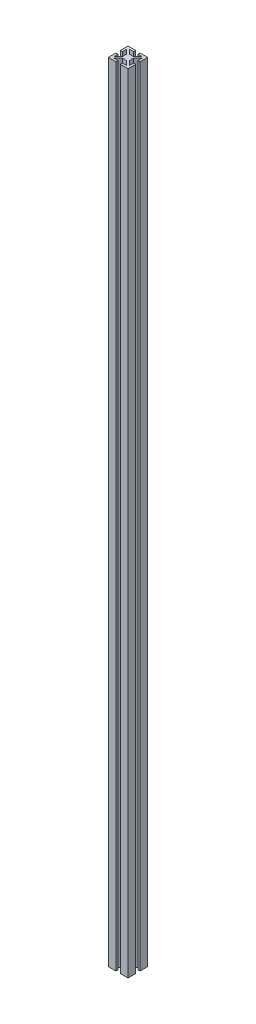
ISO-10303-21;
HEADER;
FILE_DESCRIPTION(('STEP AP214'),'2;1');
FILE_NAME('part.step','',(''),(''),'','','');
FILE_SCHEMA(('AUTOMOTIVE_DESIGN { 1 0 10303 214 1 1 1 1 }'));
ENDSEC;
DATA;
#1=APPLICATION_CONTEXT('core data for automotive mechanical design processes');
#2=APPLICATION_PROTOCOL_DEFINITION('international standard','automotive_design',2000,#1);
#3=PRODUCT_CONTEXT('',#1,'mechanical');
#4=PRODUCT('Part','Part','',(#3));
#5=PRODUCT_RELATED_PRODUCT_CATEGORY('part','',(#4));
#6=PRODUCT_DEFINITION_FORMATION('','',#4);
#7=PRODUCT_DEFINITION_CONTEXT('part definition',#1,'design');
#8=PRODUCT_DEFINITION('design','',#6,#7);
#9=PRODUCT_DEFINITION_SHAPE('','',#8);
#10=(LENGTH_UNIT() NAMED_UNIT(*) SI_UNIT(.MILLI.,.METRE.));
#11=(NAMED_UNIT(*) PLANE_ANGLE_UNIT() SI_UNIT($,.RADIAN.));
#12=(NAMED_UNIT(*) SI_UNIT($,.STERADIAN.) SOLID_ANGLE_UNIT());
#13=UNCERTAINTY_MEASURE_WITH_UNIT(LENGTH_MEASURE(1.E-05),#10,'distance_accuracy_value','');
#14=(GEOMETRIC_REPRESENTATION_CONTEXT(3) GLOBAL_UNCERTAINTY_ASSIGNED_CONTEXT((#13)) GLOBAL_UNIT_ASSIGNED_CONTEXT((#10,
#11,#12)) REPRESENTATION_CONTEXT('',''));
#15=CARTESIAN_POINT('',(0.,0.,0.));
#16=DIRECTION('',(0.,0.,1.));
#17=DIRECTION('',(1.,0.,0.));
#18=AXIS2_PLACEMENT_3D('',#15,#16,#17);
#19=CARTESIAN_POINT('',(-19.05,1524.,-19.05));
#20=DIRECTION('',(1.,0.,0.));
#21=DIRECTION('',(0.,0.,-1.));
#22=AXIS2_PLACEMENT_3D('',#19,#20,#21);
#23=PLANE('',#22);
#24=DIRECTION('',(0.,0.,1.));
#25=VECTOR('',#24,1.);
#26=CARTESIAN_POINT('',(-19.05,0.,-19.05));
#27=LINE('',#26,#25);
#28=CARTESIAN_POINT('',(-19.05,0.,-19.05));
#29=VERTEX_POINT('',#28);
#30=CARTESIAN_POINT('',(-19.05,0.,-4.06399999999999));
#31=VERTEX_POINT('',#30);
#32=EDGE_CURVE('E297',#29,#31,#27,.T.);
#33=ORIENTED_EDGE('',*,*,#32,.T.);
#34=DIRECTION('',(0.,-1.,0.));
#35=VECTOR('',#34,1.);
#36=CARTESIAN_POINT('',(-19.05,1524.,-4.06399999999999));
#37=LINE('',#36,#35);
#38=CARTESIAN_POINT('',(-19.05,1524.,-4.06399999999999));
#39=VERTEX_POINT('',#38);
#40=EDGE_CURVE('E11',#39,#31,#37,.T.);
#41=ORIENTED_EDGE('',*,*,#40,.F.);
#42=DIRECTION('',(0.,0.,1.));
#43=VECTOR('',#42,1.);
#44=CARTESIAN_POINT('',(-19.05,1524.,-19.05));
#45=LINE('',#44,#43);
#46=CARTESIAN_POINT('',(-19.05,1524.,-19.05));
#47=VERTEX_POINT('',#46);
#48=EDGE_CURVE('E367',#47,#39,#45,.T.);
#49=ORIENTED_EDGE('',*,*,#48,.F.);
#50=DIRECTION('',(0.,-1.,0.));
#51=VECTOR('',#50,1.);
#52=CARTESIAN_POINT('',(-19.05,1524.,-19.05));
#53=LINE('',#52,#51);
#54=EDGE_CURVE('E293',#47,#29,#53,.T.);
#55=ORIENTED_EDGE('',*,*,#54,.T.);
#56=EDGE_LOOP('',(#33,#41,#49,#55));
#57=FACE_BOUND('',#56,.T.);
#58=ADVANCED_FACE('F33',(#57),#23,.F.);
#59=CARTESIAN_POINT('',(-19.05,1524.,-4.06399999999999));
#60=DIRECTION('',(0.,0.,-1.));
#61=DIRECTION('',(-1.,0.,0.));
#62=AXIS2_PLACEMENT_3D('',#59,#60,#61);
#63=PLANE('',#62);
#64=DIRECTION('',(1.,0.,0.));
#65=VECTOR('',#64,1.);
#66=CARTESIAN_POINT('',(-19.05,0.,-4.06399999999999));
#67=LINE('',#66,#65);
#68=CARTESIAN_POINT('',(-14.986,0.,-4.06399999999999));
#69=VERTEX_POINT('',#68);
#70=EDGE_CURVE('E300',#31,#69,#67,.T.);
#71=ORIENTED_EDGE('',*,*,#70,.T.);
#72=DIRECTION('',(0.,-1.,0.));
#73=VECTOR('',#72,1.);
#74=CARTESIAN_POINT('',(-14.986,1524.,-4.06399999999999));
#75=LINE('',#74,#73);
#76=CARTESIAN_POINT('',(-14.986,1524.,-4.06399999999999));
#77=VERTEX_POINT('',#76);
#78=EDGE_CURVE('E41',#77,#69,#75,.T.);
#79=ORIENTED_EDGE('',*,*,#78,.F.);
#80=DIRECTION('',(1.,0.,0.));
#81=VECTOR('',#80,1.);
#82=CARTESIAN_POINT('',(-19.05,1524.,-4.06399999999999));
#83=LINE('',#82,#81);
#84=EDGE_CURVE('E176',#39,#77,#83,.T.);
#85=ORIENTED_EDGE('',*,*,#84,.F.);
#86=ORIENTED_EDGE('',*,*,#40,.T.);
#87=EDGE_LOOP('',(#71,#79,#85,#86));
#88=FACE_BOUND('',#87,.T.);
#89=ADVANCED_FACE('F565',(#88),#63,.F.);
#90=CARTESIAN_POINT('',(-14.986,1524.,-4.06399999999999));
#91=DIRECTION('',(-1.,0.,0.));
#92=DIRECTION('',(0.,0.,1.));
#93=AXIS2_PLACEMENT_3D('',#90,#91,#92);
#94=PLANE('',#93);
#95=DIRECTION('',(0.,0.,-1.));
#96=VECTOR('',#95,1.);
#97=CARTESIAN_POINT('',(-14.986,0.,-4.06399999999999));
#98=LINE('',#97,#96);
#99=CARTESIAN_POINT('',(-14.986,0.,-12.1123180412578));
#100=VERTEX_POINT('',#99);
#101=EDGE_CURVE('E302',#69,#100,#98,.T.);
#102=ORIENTED_EDGE('',*,*,#101,.T.);
#103=DIRECTION('',(0.,-1.,0.));
#104=VECTOR('',#103,1.);
#105=CARTESIAN_POINT('',(-14.986,1524.,-12.1123180412578));
#106=LINE('',#105,#104);
#107=CARTESIAN_POINT('',(-14.986,1524.,-12.1123180412578));
#108=VERTEX_POINT('',#107);
#109=EDGE_CURVE('E458',#108,#100,#106,.T.);
#110=ORIENTED_EDGE('',*,*,#109,.F.);
#111=DIRECTION('',(0.,0.,-1.));
#112=VECTOR('',#111,1.);
#113=CARTESIAN_POINT('',(-14.986,1524.,-4.06399999999999));
#114=LINE('',#113,#112);
#115=EDGE_CURVE('E466',#77,#108,#114,.T.);
#116=ORIENTED_EDGE('',*,*,#115,.F.);
#117=ORIENTED_EDGE('',*,*,#78,.T.);
#118=EDGE_LOOP('',(#102,#110,#116,#117));
#119=FACE_BOUND('',#118,.T.);
#120=ADVANCED_FACE('F464',(#119),#94,.F.);
#121=CARTESIAN_POINT('',(-14.986,1524.,-12.1123180412578));
#122=DIRECTION('',(0.707106781186547,0.,-0.707106781186548));
#123=DIRECTION('',(-0.707106781186548,0.,-0.707106781186547));
#124=AXIS2_PLACEMENT_3D('',#121,#122,#123);
#125=PLANE('',#124);
#126=DIRECTION('',(0.707106781186548,0.,0.707106781186547));
#127=VECTOR('',#126,1.);
#128=CARTESIAN_POINT('',(-14.986,0.,-12.1123180412578));
#129=LINE('',#128,#127);
#130=CARTESIAN_POINT('',(-6.7564,0.,-3.88271804125786));
#131=VERTEX_POINT('',#130);
#132=EDGE_CURVE('E304',#100,#131,#129,.T.);
#133=ORIENTED_EDGE('',*,*,#132,.T.);
#134=DIRECTION('',(0.,-1.,0.));
#135=VECTOR('',#134,1.);
#136=CARTESIAN_POINT('',(-6.7564,1524.,-3.88271804125786));
#137=LINE('',#136,#135);
#138=CARTESIAN_POINT('',(-6.7564,1524.,-3.88271804125786));
#139=VERTEX_POINT('',#138);
#140=EDGE_CURVE('E455',#139,#131,#137,.T.);
#141=ORIENTED_EDGE('',*,*,#140,.F.);
#142=DIRECTION('',(0.707106781186548,0.,0.707106781186547));
#143=VECTOR('',#142,1.);
#144=CARTESIAN_POINT('',(-14.986,1524.,-12.1123180412578));
#145=LINE('',#144,#143);
#146=EDGE_CURVE('E484',#108,#139,#145,.T.);
#147=ORIENTED_EDGE('',*,*,#146,.F.);
#148=ORIENTED_EDGE('',*,*,#109,.T.);
#149=EDGE_LOOP('',(#133,#141,#147,#148));
#150=FACE_BOUND('',#149,.T.);
#151=ADVANCED_FACE('F475',(#150),#125,.F.);
#152=CARTESIAN_POINT('',(-6.7564,1524.,-3.88271804125786));
#153=DIRECTION('',(1.,0.,0.));
#154=DIRECTION('',(0.,0.,-1.));
#155=AXIS2_PLACEMENT_3D('',#152,#153,#154);
#156=PLANE('',#155);
#157=DIRECTION('',(0.,0.,1.));
#158=VECTOR('',#157,1.);
#159=CARTESIAN_POINT('',(-6.7564,0.,-3.88271804125786));
#160=LINE('',#159,#158);
#161=CARTESIAN_POINT('',(-6.7564,0.,3.88271804125787));
#162=VERTEX_POINT('',#161);
#163=EDGE_CURVE('E306',#131,#162,#160,.T.);
#164=ORIENTED_EDGE('',*,*,#163,.T.);
#165=DIRECTION('',(0.,-1.,0.));
#166=VECTOR('',#165,1.);
#167=CARTESIAN_POINT('',(-6.7564,1524.,3.88271804125787));
#168=LINE('',#167,#166);
#169=CARTESIAN_POINT('',(-6.7564,1524.,3.88271804125787));
#170=VERTEX_POINT('',#169);
#171=EDGE_CURVE('E452',#170,#162,#168,.T.);
#172=ORIENTED_EDGE('',*,*,#171,.F.);
#173=DIRECTION('',(0.,0.,1.));
#174=VECTOR('',#173,1.);
#175=CARTESIAN_POINT('',(-6.7564,1524.,-3.88271804125786));
#176=LINE('',#175,#174);
#177=EDGE_CURVE('E481',#139,#170,#176,.T.);
#178=ORIENTED_EDGE('',*,*,#177,.F.);
#179=ORIENTED_EDGE('',*,*,#140,.T.);
#180=EDGE_LOOP('',(#164,#172,#178,#179));
#181=FACE_BOUND('',#180,.T.);
#182=ADVANCED_FACE('F479',(#181),#156,.F.);
#183=CARTESIAN_POINT('',(-14.986,1524.,12.1123180412579));
#184=DIRECTION('',(0.707106781186548,0.,0.707106781186547));
#185=DIRECTION('',(0.707106781186547,0.,-0.707106781186548));
#186=AXIS2_PLACEMENT_3D('',#183,#184,#185);
#187=PLANE('',#186);
#188=DIRECTION('',(-0.707106781186547,0.,0.707106781186548));
#189=VECTOR('',#188,1.);
#190=CARTESIAN_POINT('',(-14.986,0.,12.1123180412579));
#191=LINE('',#190,#189);
#192=CARTESIAN_POINT('',(-14.986,0.,12.1123180412579));
#193=VERTEX_POINT('',#192);
#194=EDGE_CURVE('E308',#162,#193,#191,.T.);
#195=ORIENTED_EDGE('',*,*,#194,.T.);
#196=DIRECTION('',(0.,-1.,0.));
#197=VECTOR('',#196,1.);
#198=CARTESIAN_POINT('',(-14.986,1524.,12.1123180412579));
#199=LINE('',#198,#197);
#200=CARTESIAN_POINT('',(-14.986,1524.,12.1123180412579));
#201=VERTEX_POINT('',#200);
#202=EDGE_CURVE('E449',#201,#193,#199,.T.);
#203=ORIENTED_EDGE('',*,*,#202,.F.);
#204=DIRECTION('',(-0.707106781186547,0.,0.707106781186548));
#205=VECTOR('',#204,1.);
#206=CARTESIAN_POINT('',(-14.986,1524.,12.1123180412579));
#207=LINE('',#206,#205);
#208=EDGE_CURVE('E483',#170,#201,#207,.T.);
#209=ORIENTED_EDGE('',*,*,#208,.F.);
#210=ORIENTED_EDGE('',*,*,#171,.T.);
#211=EDGE_LOOP('',(#195,#203,#209,#210));
#212=FACE_BOUND('',#211,.T.);
#213=ADVANCED_FACE('F578',(#212),#187,.F.);
#214=CARTESIAN_POINT('',(-14.986,1524.,4.06399999999999));
#215=DIRECTION('',(-1.,0.,0.));
#216=DIRECTION('',(0.,0.,1.));
#217=AXIS2_PLACEMENT_3D('',#214,#215,#216);
#218=PLANE('',#217);
#219=DIRECTION('',(0.,0.,-1.));
#220=VECTOR('',#219,1.);
#221=CARTESIAN_POINT('',(-14.986,0.,4.06399999999999));
#222=LINE('',#221,#220);
#223=CARTESIAN_POINT('',(-14.986,0.,4.06399999999999));
#224=VERTEX_POINT('',#223);
#225=EDGE_CURVE('E310',#193,#224,#222,.T.);
#226=ORIENTED_EDGE('',*,*,#225,.T.);
#227=DIRECTION('',(0.,-1.,0.));
#228=VECTOR('',#227,1.);
#229=CARTESIAN_POINT('',(-14.986,1524.,4.06399999999999));
#230=LINE('',#229,#228);
#231=CARTESIAN_POINT('',(-14.986,1524.,4.06399999999999));
#232=VERTEX_POINT('',#231);
#233=EDGE_CURVE('E446',#232,#224,#230,.T.);
#234=ORIENTED_EDGE('',*,*,#233,.F.);
#235=DIRECTION('',(0.,0.,-1.));
#236=VECTOR('',#235,1.);
#237=CARTESIAN_POINT('',(-14.986,1524.,4.06399999999999));
#238=LINE('',#237,#236);
#239=EDGE_CURVE('E486',#201,#232,#238,.T.);
#240=ORIENTED_EDGE('',*,*,#239,.F.);
#241=ORIENTED_EDGE('',*,*,#202,.T.);
#242=EDGE_LOOP('',(#226,#234,#240,#241));
#243=FACE_BOUND('',#242,.T.);
#244=ADVANCED_FACE('F581',(#243),#218,.F.);
#245=CARTESIAN_POINT('',(-19.05,1524.,4.06399999999999));
#246=DIRECTION('',(0.,0.,1.));
#247=DIRECTION('',(1.,0.,0.));
#248=AXIS2_PLACEMENT_3D('',#245,#246,#247);
#249=PLANE('',#248);
#250=DIRECTION('',(-1.,0.,0.));
#251=VECTOR('',#250,1.);
#252=CARTESIAN_POINT('',(-19.05,0.,4.06399999999999));
#253=LINE('',#252,#251);
#254=CARTESIAN_POINT('',(-19.05,0.,4.06399999999999));
#255=VERTEX_POINT('',#254);
#256=EDGE_CURVE('E312',#224,#255,#253,.T.);
#257=ORIENTED_EDGE('',*,*,#256,.T.);
#258=DIRECTION('',(0.,-1.,0.));
#259=VECTOR('',#258,1.);
#260=CARTESIAN_POINT('',(-19.05,1524.,4.06399999999999));
#261=LINE('',#260,#259);
#262=CARTESIAN_POINT('',(-19.05,1524.,4.06399999999999));
#263=VERTEX_POINT('',#262);
#264=EDGE_CURVE('E443',#263,#255,#261,.T.);
#265=ORIENTED_EDGE('',*,*,#264,.F.);
#266=DIRECTION('',(-1.,0.,0.));
#267=VECTOR('',#266,1.);
#268=CARTESIAN_POINT('',(-19.05,1524.,4.06399999999999));
#269=LINE('',#268,#267);
#270=EDGE_CURVE('E492',#232,#263,#269,.T.);
#271=ORIENTED_EDGE('',*,*,#270,.F.);
#272=ORIENTED_EDGE('',*,*,#233,.T.);
#273=EDGE_LOOP('',(#257,#265,#271,#272));
#274=FACE_BOUND('',#273,.T.);
#275=ADVANCED_FACE('F585',(#274),#249,.F.);
#276=CARTESIAN_POINT('',(-19.05,1524.,19.05));
#277=DIRECTION('',(1.,0.,0.));
#278=DIRECTION('',(0.,0.,-1.));
#279=AXIS2_PLACEMENT_3D('',#276,#277,#278);
#280=PLANE('',#279);
#281=DIRECTION('',(0.,0.,1.));
#282=VECTOR('',#281,1.);
#283=CARTESIAN_POINT('',(-19.05,0.,19.05));
#284=LINE('',#283,#282);
#285=CARTESIAN_POINT('',(-19.05,0.,19.05));
#286=VERTEX_POINT('',#285);
#287=EDGE_CURVE('E314',#255,#286,#284,.T.);
#288=ORIENTED_EDGE('',*,*,#287,.T.);
#289=DIRECTION('',(0.,-1.,0.));
#290=VECTOR('',#289,1.);
#291=CARTESIAN_POINT('',(-19.05,1524.,19.05));
#292=LINE('',#291,#290);
#293=CARTESIAN_POINT('',(-19.05,1524.,19.05));
#294=VERTEX_POINT('',#293);
#295=EDGE_CURVE('E440',#294,#286,#292,.T.);
#296=ORIENTED_EDGE('',*,*,#295,.F.);
#297=DIRECTION('',(0.,0.,1.));
#298=VECTOR('',#297,1.);
#299=CARTESIAN_POINT('',(-19.05,1524.,19.05));
#300=LINE('',#299,#298);
#301=EDGE_CURVE('E494',#263,#294,#300,.T.);
#302=ORIENTED_EDGE('',*,*,#301,.F.);
#303=ORIENTED_EDGE('',*,*,#264,.T.);
#304=EDGE_LOOP('',(#288,#296,#302,#303));
#305=FACE_BOUND('',#304,.T.);
#306=ADVANCED_FACE('F589',(#305),#280,.F.);
#307=CARTESIAN_POINT('',(-19.05,1524.,19.05));
#308=DIRECTION('',(0.,0.,-1.));
#309=DIRECTION('',(-1.,0.,0.));
#310=AXIS2_PLACEMENT_3D('',#307,#308,#309);
#311=PLANE('',#310);
#312=DIRECTION('',(1.,0.,0.));
#313=VECTOR('',#312,1.);
#314=CARTESIAN_POINT('',(-19.05,0.,19.05));
#315=LINE('',#314,#313);
#316=CARTESIAN_POINT('',(-4.064,0.,19.05));
#317=VERTEX_POINT('',#316);
#318=EDGE_CURVE('E316',#286,#317,#315,.T.);
#319=ORIENTED_EDGE('',*,*,#318,.T.);
#320=DIRECTION('',(0.,-1.,0.));
#321=VECTOR('',#320,1.);
#322=CARTESIAN_POINT('',(-4.064,1524.,19.05));
#323=LINE('',#322,#321);
#324=CARTESIAN_POINT('',(-4.064,1524.,19.05));
#325=VERTEX_POINT('',#324);
#326=EDGE_CURVE('E437',#325,#317,#323,.T.);
#327=ORIENTED_EDGE('',*,*,#326,.F.);
#328=DIRECTION('',(1.,0.,0.));
#329=VECTOR('',#328,1.);
#330=CARTESIAN_POINT('',(-19.05,1524.,19.05));
#331=LINE('',#330,#329);
#332=EDGE_CURVE('E496',#294,#325,#331,.T.);
#333=ORIENTED_EDGE('',*,*,#332,.F.);
#334=ORIENTED_EDGE('',*,*,#295,.T.);
#335=EDGE_LOOP('',(#319,#327,#333,#334));
#336=FACE_BOUND('',#335,.T.);
#337=ADVANCED_FACE('F593',(#336),#311,.F.);
#338=CARTESIAN_POINT('',(-4.064,1524.,19.05));
#339=DIRECTION('',(-1.,0.,0.));
#340=DIRECTION('',(0.,0.,1.));
#341=AXIS2_PLACEMENT_3D('',#338,#339,#340);
#342=PLANE('',#341);
#343=DIRECTION('',(0.,0.,-1.));
#344=VECTOR('',#343,1.);
#345=CARTESIAN_POINT('',(-4.064,0.,19.05));
#346=LINE('',#345,#344);
#347=CARTESIAN_POINT('',(-4.064,0.,14.986));
#348=VERTEX_POINT('',#347);
#349=EDGE_CURVE('E318',#317,#348,#346,.T.);
#350=ORIENTED_EDGE('',*,*,#349,.T.);
#351=DIRECTION('',(0.,-1.,0.));
#352=VECTOR('',#351,1.);
#353=CARTESIAN_POINT('',(-4.064,1524.,14.986));
#354=LINE('',#353,#352);
#355=CARTESIAN_POINT('',(-4.064,1524.,14.986));
#356=VERTEX_POINT('',#355);
#357=EDGE_CURVE('E434',#356,#348,#354,.T.);
#358=ORIENTED_EDGE('',*,*,#357,.F.);
#359=DIRECTION('',(0.,0.,-1.));
#360=VECTOR('',#359,1.);
#361=CARTESIAN_POINT('',(-4.064,1524.,19.05));
#362=LINE('',#361,#360);
#363=EDGE_CURVE('E498',#325,#356,#362,.T.);
#364=ORIENTED_EDGE('',*,*,#363,.F.);
#365=ORIENTED_EDGE('',*,*,#326,.T.);
#366=EDGE_LOOP('',(#350,#358,#364,#365));
#367=FACE_BOUND('',#366,.T.);
#368=ADVANCED_FACE('F597',(#367),#342,.F.);
#369=CARTESIAN_POINT('',(-4.064,1524.,14.986));
#370=DIRECTION('',(0.,0.,1.));
#371=DIRECTION('',(1.,0.,0.));
#372=AXIS2_PLACEMENT_3D('',#369,#370,#371);
#373=PLANE('',#372);
#374=DIRECTION('',(-1.,0.,0.));
#375=VECTOR('',#374,1.);
#376=CARTESIAN_POINT('',(-4.064,0.,14.986));
#377=LINE('',#376,#375);
#378=CARTESIAN_POINT('',(-12.1123180412579,0.,14.986));
#379=VERTEX_POINT('',#378);
#380=EDGE_CURVE('E320',#348,#379,#377,.T.);
#381=ORIENTED_EDGE('',*,*,#380,.T.);
#382=DIRECTION('',(0.,-1.,0.));
#383=VECTOR('',#382,1.);
#384=CARTESIAN_POINT('',(-12.1123180412579,1524.,14.986));
#385=LINE('',#384,#383);
#386=CARTESIAN_POINT('',(-12.1123180412579,1524.,14.986));
#387=VERTEX_POINT('',#386);
#388=EDGE_CURVE('E431',#387,#379,#385,.T.);
#389=ORIENTED_EDGE('',*,*,#388,.F.);
#390=DIRECTION('',(-1.,0.,0.));
#391=VECTOR('',#390,1.);
#392=CARTESIAN_POINT('',(-4.064,1524.,14.986));
#393=LINE('',#392,#391);
#394=EDGE_CURVE('E500',#356,#387,#393,.T.);
#395=ORIENTED_EDGE('',*,*,#394,.F.);
#396=ORIENTED_EDGE('',*,*,#357,.T.);
#397=EDGE_LOOP('',(#381,#389,#395,#396));
#398=FACE_BOUND('',#397,.T.);
#399=ADVANCED_FACE('F601',(#398),#373,.F.);
#400=CARTESIAN_POINT('',(-12.1123180412579,1524.,14.986));
#401=DIRECTION('',(-0.707106781186548,0.,-0.707106781186547));
#402=DIRECTION('',(-0.707106781186547,0.,0.707106781186548));
#403=AXIS2_PLACEMENT_3D('',#400,#401,#402);
#404=PLANE('',#403);
#405=DIRECTION('',(0.707106781186547,0.,-0.707106781186548));
#406=VECTOR('',#405,1.);
#407=CARTESIAN_POINT('',(-12.1123180412579,0.,14.986));
#408=LINE('',#407,#406);
#409=CARTESIAN_POINT('',(-3.88271804125786,0.,6.7564));
#410=VERTEX_POINT('',#409);
#411=EDGE_CURVE('E322',#379,#410,#408,.T.);
#412=ORIENTED_EDGE('',*,*,#411,.T.);
#413=DIRECTION('',(0.,-1.,0.));
#414=VECTOR('',#413,1.);
#415=CARTESIAN_POINT('',(-3.88271804125786,1524.,6.7564));
#416=LINE('',#415,#414);
#417=CARTESIAN_POINT('',(-3.88271804125786,1524.,6.7564));
#418=VERTEX_POINT('',#417);
#419=EDGE_CURVE('E428',#418,#410,#416,.T.);
#420=ORIENTED_EDGE('',*,*,#419,.F.);
#421=DIRECTION('',(0.707106781186547,0.,-0.707106781186548));
#422=VECTOR('',#421,1.);
#423=CARTESIAN_POINT('',(-12.1123180412579,1524.,14.986));
#424=LINE('',#423,#422);
#425=EDGE_CURVE('E502',#387,#418,#424,.T.);
#426=ORIENTED_EDGE('',*,*,#425,.F.);
#427=ORIENTED_EDGE('',*,*,#388,.T.);
#428=EDGE_LOOP('',(#412,#420,#426,#427));
#429=FACE_BOUND('',#428,.T.);
#430=ADVANCED_FACE('F605',(#429),#404,.F.);
#431=CARTESIAN_POINT('',(-3.88271804125786,1524.,6.7564));
#432=DIRECTION('',(0.,0.,-1.));
#433=DIRECTION('',(-1.,0.,0.));
#434=AXIS2_PLACEMENT_3D('',#431,#432,#433);
#435=PLANE('',#434);
#436=DIRECTION('',(1.,0.,0.));
#437=VECTOR('',#436,1.);
#438=CARTESIAN_POINT('',(-3.88271804125786,0.,6.7564));
#439=LINE('',#438,#437);
#440=CARTESIAN_POINT('',(3.88271804125786,0.,6.7564));
#441=VERTEX_POINT('',#440);
#442=EDGE_CURVE('E324',#410,#441,#439,.T.);
#443=ORIENTED_EDGE('',*,*,#442,.T.);
#444=DIRECTION('',(0.,-1.,0.));
#445=VECTOR('',#444,1.);
#446=CARTESIAN_POINT('',(3.88271804125786,1524.,6.7564));
#447=LINE('',#446,#445);
#448=CARTESIAN_POINT('',(3.88271804125786,1524.,6.7564));
#449=VERTEX_POINT('',#448);
#450=EDGE_CURVE('E425',#449,#441,#447,.T.);
#451=ORIENTED_EDGE('',*,*,#450,.F.);
#452=DIRECTION('',(1.,0.,0.));
#453=VECTOR('',#452,1.);
#454=CARTESIAN_POINT('',(-3.88271804125786,1524.,6.7564));
#455=LINE('',#454,#453);
#456=EDGE_CURVE('E504',#418,#449,#455,.T.);
#457=ORIENTED_EDGE('',*,*,#456,.F.);
#458=ORIENTED_EDGE('',*,*,#419,.T.);
#459=EDGE_LOOP('',(#443,#451,#457,#458));
#460=FACE_BOUND('',#459,.T.);
#461=ADVANCED_FACE('F609',(#460),#435,.F.);
#462=CARTESIAN_POINT('',(12.1123180412579,1524.,14.986));
#463=DIRECTION('',(0.707106781186548,0.,-0.707106781186548));
#464=DIRECTION('',(-0.707106781186548,0.,-0.707106781186548));
#465=AXIS2_PLACEMENT_3D('',#462,#463,#464);
#466=PLANE('',#465);
#467=DIRECTION('',(0.707106781186547,0.,0.707106781186547));
#468=VECTOR('',#467,1.);
#469=CARTESIAN_POINT('',(12.1123180412579,0.,14.986));
#470=LINE('',#469,#468);
#471=CARTESIAN_POINT('',(12.1123180412579,0.,14.986));
#472=VERTEX_POINT('',#471);
#473=EDGE_CURVE('E326',#441,#472,#470,.T.);
#474=ORIENTED_EDGE('',*,*,#473,.T.);
#475=DIRECTION('',(0.,-1.,0.));
#476=VECTOR('',#475,1.);
#477=CARTESIAN_POINT('',(12.1123180412579,1524.,14.986));
#478=LINE('',#477,#476);
#479=CARTESIAN_POINT('',(12.1123180412579,1524.,14.986));
#480=VERTEX_POINT('',#479);
#481=EDGE_CURVE('E422',#480,#472,#478,.T.);
#482=ORIENTED_EDGE('',*,*,#481,.F.);
#483=DIRECTION('',(0.707106781186547,0.,0.707106781186547));
#484=VECTOR('',#483,1.);
#485=CARTESIAN_POINT('',(12.1123180412579,1524.,14.986));
#486=LINE('',#485,#484);
#487=EDGE_CURVE('E506',#449,#480,#486,.T.);
#488=ORIENTED_EDGE('',*,*,#487,.F.);
#489=ORIENTED_EDGE('',*,*,#450,.T.);
#490=EDGE_LOOP('',(#474,#482,#488,#489));
#491=FACE_BOUND('',#490,.T.);
#492=ADVANCED_FACE('F613',(#491),#466,.F.);
#493=CARTESIAN_POINT('',(4.064,1524.,14.986));
#494=DIRECTION('',(0.,0.,1.));
#495=DIRECTION('',(1.,0.,0.));
#496=AXIS2_PLACEMENT_3D('',#493,#494,#495);
#497=PLANE('',#496);
#498=DIRECTION('',(-1.,0.,0.));
#499=VECTOR('',#498,1.);
#500=CARTESIAN_POINT('',(4.064,0.,14.986));
#501=LINE('',#500,#499);
#502=CARTESIAN_POINT('',(4.064,0.,14.986));
#503=VERTEX_POINT('',#502);
#504=EDGE_CURVE('E328',#472,#503,#501,.T.);
#505=ORIENTED_EDGE('',*,*,#504,.T.);
#506=DIRECTION('',(0.,-1.,0.));
#507=VECTOR('',#506,1.);
#508=CARTESIAN_POINT('',(4.064,1524.,14.986));
#509=LINE('',#508,#507);
#510=CARTESIAN_POINT('',(4.064,1524.,14.986));
#511=VERTEX_POINT('',#510);
#512=EDGE_CURVE('E419',#511,#503,#509,.T.);
#513=ORIENTED_EDGE('',*,*,#512,.F.);
#514=DIRECTION('',(-1.,0.,0.));
#515=VECTOR('',#514,1.);
#516=CARTESIAN_POINT('',(4.064,1524.,14.986));
#517=LINE('',#516,#515);
#518=EDGE_CURVE('E508',#480,#511,#517,.T.);
#519=ORIENTED_EDGE('',*,*,#518,.F.);
#520=ORIENTED_EDGE('',*,*,#481,.T.);
#521=EDGE_LOOP('',(#505,#513,#519,#520));
#522=FACE_BOUND('',#521,.T.);
#523=ADVANCED_FACE('F617',(#522),#497,.F.);
#524=CARTESIAN_POINT('',(4.06400000000001,1524.,19.05));
#525=DIRECTION('',(1.,0.,0.));
#526=DIRECTION('',(0.,0.,-1.));
#527=AXIS2_PLACEMENT_3D('',#524,#525,#526);
#528=PLANE('',#527);
#529=DIRECTION('',(0.,0.,1.));
#530=VECTOR('',#529,1.);
#531=CARTESIAN_POINT('',(4.06400000000001,0.,19.05));
#532=LINE('',#531,#530);
#533=CARTESIAN_POINT('',(4.06400000000001,0.,19.05));
#534=VERTEX_POINT('',#533);
#535=EDGE_CURVE('E330',#503,#534,#532,.T.);
#536=ORIENTED_EDGE('',*,*,#535,.T.);
#537=DIRECTION('',(0.,-1.,0.));
#538=VECTOR('',#537,1.);
#539=CARTESIAN_POINT('',(4.06400000000001,1524.,19.05));
#540=LINE('',#539,#538);
#541=CARTESIAN_POINT('',(4.06400000000001,1524.,19.05));
#542=VERTEX_POINT('',#541);
#543=EDGE_CURVE('E416',#542,#534,#540,.T.);
#544=ORIENTED_EDGE('',*,*,#543,.F.);
#545=DIRECTION('',(0.,0.,1.));
#546=VECTOR('',#545,1.);
#547=CARTESIAN_POINT('',(4.06400000000001,1524.,19.05));
#548=LINE('',#547,#546);
#549=EDGE_CURVE('E510',#511,#542,#548,.T.);
#550=ORIENTED_EDGE('',*,*,#549,.F.);
#551=ORIENTED_EDGE('',*,*,#512,.T.);
#552=EDGE_LOOP('',(#536,#544,#550,#551));
#553=FACE_BOUND('',#552,.T.);
#554=ADVANCED_FACE('F621',(#553),#528,.F.);
#555=CARTESIAN_POINT('',(19.05,1524.,19.05));
#556=DIRECTION('',(0.,0.,-1.));
#557=DIRECTION('',(-1.,0.,0.));
#558=AXIS2_PLACEMENT_3D('',#555,#556,#557);
#559=PLANE('',#558);
#560=DIRECTION('',(1.,0.,0.));
#561=VECTOR('',#560,1.);
#562=CARTESIAN_POINT('',(19.05,0.,19.05));
#563=LINE('',#562,#561);
#564=CARTESIAN_POINT('',(19.05,0.,19.05));
#565=VERTEX_POINT('',#564);
#566=EDGE_CURVE('E332',#534,#565,#563,.T.);
#567=ORIENTED_EDGE('',*,*,#566,.T.);
#568=DIRECTION('',(0.,-1.,0.));
#569=VECTOR('',#568,1.);
#570=CARTESIAN_POINT('',(19.05,1524.,19.05));
#571=LINE('',#570,#569);
#572=CARTESIAN_POINT('',(19.05,1524.,19.05));
#573=VERTEX_POINT('',#572);
#574=EDGE_CURVE('E413',#573,#565,#571,.T.);
#575=ORIENTED_EDGE('',*,*,#574,.F.);
#576=DIRECTION('',(1.,0.,0.));
#577=VECTOR('',#576,1.);
#578=CARTESIAN_POINT('',(19.05,1524.,19.05));
#579=LINE('',#578,#577);
#580=EDGE_CURVE('E512',#542,#573,#579,.T.);
#581=ORIENTED_EDGE('',*,*,#580,.F.);
#582=ORIENTED_EDGE('',*,*,#543,.T.);
#583=EDGE_LOOP('',(#567,#575,#581,#582));
#584=FACE_BOUND('',#583,.T.);
#585=ADVANCED_FACE('F625',(#584),#559,.F.);
#586=CARTESIAN_POINT('',(19.05,1524.,19.05));
#587=DIRECTION('',(-1.,0.,0.));
#588=DIRECTION('',(0.,0.,1.));
#589=AXIS2_PLACEMENT_3D('',#586,#587,#588);
#590=PLANE('',#589);
#591=DIRECTION('',(0.,0.,-1.));
#592=VECTOR('',#591,1.);
#593=CARTESIAN_POINT('',(19.05,0.,19.05));
#594=LINE('',#593,#592);
#595=CARTESIAN_POINT('',(19.05,0.,4.06399999999999));
#596=VERTEX_POINT('',#595);
#597=EDGE_CURVE('E334',#565,#596,#594,.T.);
#598=ORIENTED_EDGE('',*,*,#597,.T.);
#599=DIRECTION('',(0.,-1.,0.));
#600=VECTOR('',#599,1.);
#601=CARTESIAN_POINT('',(19.05,1524.,4.06399999999999));
#602=LINE('',#601,#600);
#603=CARTESIAN_POINT('',(19.05,1524.,4.06399999999999));
#604=VERTEX_POINT('',#603);
#605=EDGE_CURVE('E410',#604,#596,#602,.T.);
#606=ORIENTED_EDGE('',*,*,#605,.F.);
#607=DIRECTION('',(0.,0.,-1.));
#608=VECTOR('',#607,1.);
#609=CARTESIAN_POINT('',(19.05,1524.,19.05));
#610=LINE('',#609,#608);
#611=EDGE_CURVE('E514',#573,#604,#610,.T.);
#612=ORIENTED_EDGE('',*,*,#611,.F.);
#613=ORIENTED_EDGE('',*,*,#574,.T.);
#614=EDGE_LOOP('',(#598,#606,#612,#613));
#615=FACE_BOUND('',#614,.T.);
#616=ADVANCED_FACE('F629',(#615),#590,.F.);
#617=CARTESIAN_POINT('',(19.05,1524.,4.06399999999999));
#618=DIRECTION('',(0.,0.,1.));
#619=DIRECTION('',(1.,0.,0.));
#620=AXIS2_PLACEMENT_3D('',#617,#618,#619);
#621=PLANE('',#620);
#622=DIRECTION('',(-1.,0.,0.));
#623=VECTOR('',#622,1.);
#624=CARTESIAN_POINT('',(19.05,0.,4.06399999999999));
#625=LINE('',#624,#623);
#626=CARTESIAN_POINT('',(14.986,0.,4.06399999999999));
#627=VERTEX_POINT('',#626);
#628=EDGE_CURVE('E336',#596,#627,#625,.T.);
#629=ORIENTED_EDGE('',*,*,#628,.T.);
#630=DIRECTION('',(0.,-1.,0.));
#631=VECTOR('',#630,1.);
#632=CARTESIAN_POINT('',(14.986,1524.,4.06399999999999));
#633=LINE('',#632,#631);
#634=CARTESIAN_POINT('',(14.986,1524.,4.06399999999999));
#635=VERTEX_POINT('',#634);
#636=EDGE_CURVE('E407',#635,#627,#633,.T.);
#637=ORIENTED_EDGE('',*,*,#636,.F.);
#638=DIRECTION('',(-1.,0.,0.));
#639=VECTOR('',#638,1.);
#640=CARTESIAN_POINT('',(19.05,1524.,4.06399999999999));
#641=LINE('',#640,#639);
#642=EDGE_CURVE('E516',#604,#635,#641,.T.);
#643=ORIENTED_EDGE('',*,*,#642,.F.);
#644=ORIENTED_EDGE('',*,*,#605,.T.);
#645=EDGE_LOOP('',(#629,#637,#643,#644));
#646=FACE_BOUND('',#645,.T.);
#647=ADVANCED_FACE('F633',(#646),#621,.F.);
#648=CARTESIAN_POINT('',(14.986,1524.,4.06399999999999));
#649=DIRECTION('',(1.,0.,0.));
#650=DIRECTION('',(0.,0.,-1.));
#651=AXIS2_PLACEMENT_3D('',#648,#649,#650);
#652=PLANE('',#651);
#653=DIRECTION('',(0.,0.,1.));
#654=VECTOR('',#653,1.);
#655=CARTESIAN_POINT('',(14.986,0.,4.06399999999999));
#656=LINE('',#655,#654);
#657=CARTESIAN_POINT('',(14.986,0.,12.1123180412579));
#658=VERTEX_POINT('',#657);
#659=EDGE_CURVE('E338',#627,#658,#656,.T.);
#660=ORIENTED_EDGE('',*,*,#659,.T.);
#661=DIRECTION('',(0.,-1.,0.));
#662=VECTOR('',#661,1.);
#663=CARTESIAN_POINT('',(14.986,1524.,12.1123180412579));
#664=LINE('',#663,#662);
#665=CARTESIAN_POINT('',(14.986,1524.,12.1123180412579));
#666=VERTEX_POINT('',#665);
#667=EDGE_CURVE('E404',#666,#658,#664,.T.);
#668=ORIENTED_EDGE('',*,*,#667,.F.);
#669=DIRECTION('',(0.,0.,1.));
#670=VECTOR('',#669,1.);
#671=CARTESIAN_POINT('',(14.986,1524.,4.06399999999999));
#672=LINE('',#671,#670);
#673=EDGE_CURVE('E518',#635,#666,#672,.T.);
#674=ORIENTED_EDGE('',*,*,#673,.F.);
#675=ORIENTED_EDGE('',*,*,#636,.T.);
#676=EDGE_LOOP('',(#660,#668,#674,#675));
#677=FACE_BOUND('',#676,.T.);
#678=ADVANCED_FACE('F637',(#677),#652,.F.);
#679=CARTESIAN_POINT('',(14.986,1524.,12.1123180412579));
#680=DIRECTION('',(-0.707106781186548,0.,0.707106781186548));
#681=DIRECTION('',(0.707106781186548,0.,0.707106781186548));
#682=AXIS2_PLACEMENT_3D('',#679,#680,#681);
#683=PLANE('',#682);
#684=DIRECTION('',(-0.707106781186547,0.,-0.707106781186547));
#685=VECTOR('',#684,1.);
#686=CARTESIAN_POINT('',(14.986,0.,12.1123180412579));
#687=LINE('',#686,#685);
#688=CARTESIAN_POINT('',(6.7564,0.,3.88271804125787));
#689=VERTEX_POINT('',#688);
#690=EDGE_CURVE('E340',#658,#689,#687,.T.);
#691=ORIENTED_EDGE('',*,*,#690,.T.);
#692=DIRECTION('',(0.,-1.,0.));
#693=VECTOR('',#692,1.);
#694=CARTESIAN_POINT('',(6.7564,1524.,3.88271804125787));
#695=LINE('',#694,#693);
#696=CARTESIAN_POINT('',(6.7564,1524.,3.88271804125787));
#697=VERTEX_POINT('',#696);
#698=EDGE_CURVE('E401',#697,#689,#695,.T.);
#699=ORIENTED_EDGE('',*,*,#698,.F.);
#700=DIRECTION('',(-0.707106781186547,0.,-0.707106781186547));
#701=VECTOR('',#700,1.);
#702=CARTESIAN_POINT('',(14.986,1524.,12.1123180412579));
#703=LINE('',#702,#701);
#704=EDGE_CURVE('E520',#666,#697,#703,.T.);
#705=ORIENTED_EDGE('',*,*,#704,.F.);
#706=ORIENTED_EDGE('',*,*,#667,.T.);
#707=EDGE_LOOP('',(#691,#699,#705,#706));
#708=FACE_BOUND('',#707,.T.);
#709=ADVANCED_FACE('F641',(#708),#683,.F.);
#710=CARTESIAN_POINT('',(6.7564,1524.,-3.88271804125786));
#711=DIRECTION('',(-1.,0.,0.));
#712=DIRECTION('',(0.,0.,1.));
#713=AXIS2_PLACEMENT_3D('',#710,#711,#712);
#714=PLANE('',#713);
#715=DIRECTION('',(0.,0.,-1.));
#716=VECTOR('',#715,1.);
#717=CARTESIAN_POINT('',(6.7564,0.,-3.88271804125786));
#718=LINE('',#717,#716);
#719=CARTESIAN_POINT('',(6.7564,0.,-3.88271804125786));
#720=VERTEX_POINT('',#719);
#721=EDGE_CURVE('E342',#689,#720,#718,.T.);
#722=ORIENTED_EDGE('',*,*,#721,.T.);
#723=DIRECTION('',(0.,-1.,0.));
#724=VECTOR('',#723,1.);
#725=CARTESIAN_POINT('',(6.7564,1524.,-3.88271804125786));
#726=LINE('',#725,#724);
#727=CARTESIAN_POINT('',(6.7564,1524.,-3.88271804125786));
#728=VERTEX_POINT('',#727);
#729=EDGE_CURVE('E398',#728,#720,#726,.T.);
#730=ORIENTED_EDGE('',*,*,#729,.F.);
#731=DIRECTION('',(0.,0.,-1.));
#732=VECTOR('',#731,1.);
#733=CARTESIAN_POINT('',(6.7564,1524.,-3.88271804125786));
#734=LINE('',#733,#732);
#735=EDGE_CURVE('E522',#697,#728,#734,.T.);
#736=ORIENTED_EDGE('',*,*,#735,.F.);
#737=ORIENTED_EDGE('',*,*,#698,.T.);
#738=EDGE_LOOP('',(#722,#730,#736,#737));
#739=FACE_BOUND('',#738,.T.);
#740=ADVANCED_FACE('F645',(#739),#714,.F.);
#741=CARTESIAN_POINT('',(14.986,1524.,-12.1123180412579));
#742=DIRECTION('',(-0.707106781186547,0.,-0.707106781186548));
#743=DIRECTION('',(-0.707106781186548,0.,0.707106781186547));
#744=AXIS2_PLACEMENT_3D('',#741,#742,#743);
#745=PLANE('',#744);
#746=DIRECTION('',(0.707106781186548,0.,-0.707106781186547));
#747=VECTOR('',#746,1.);
#748=CARTESIAN_POINT('',(14.986,0.,-12.1123180412579));
#749=LINE('',#748,#747);
#750=CARTESIAN_POINT('',(14.986,0.,-12.1123180412579));
#751=VERTEX_POINT('',#750);
#752=EDGE_CURVE('E344',#720,#751,#749,.T.);
#753=ORIENTED_EDGE('',*,*,#752,.T.);
#754=DIRECTION('',(0.,-1.,0.));
#755=VECTOR('',#754,1.);
#756=CARTESIAN_POINT('',(14.986,1524.,-12.1123180412579));
#757=LINE('',#756,#755);
#758=CARTESIAN_POINT('',(14.986,1524.,-12.1123180412579));
#759=VERTEX_POINT('',#758);
#760=EDGE_CURVE('E395',#759,#751,#757,.T.);
#761=ORIENTED_EDGE('',*,*,#760,.F.);
#762=DIRECTION('',(0.707106781186548,0.,-0.707106781186547));
#763=VECTOR('',#762,1.);
#764=CARTESIAN_POINT('',(14.986,1524.,-12.1123180412579));
#765=LINE('',#764,#763);
#766=EDGE_CURVE('E524',#728,#759,#765,.T.);
#767=ORIENTED_EDGE('',*,*,#766,.F.);
#768=ORIENTED_EDGE('',*,*,#729,.T.);
#769=EDGE_LOOP('',(#753,#761,#767,#768));
#770=FACE_BOUND('',#769,.T.);
#771=ADVANCED_FACE('F649',(#770),#745,.F.);
#772=CARTESIAN_POINT('',(14.986,1524.,-4.06399999999999));
#773=DIRECTION('',(1.,0.,0.));
#774=DIRECTION('',(0.,0.,-1.));
#775=AXIS2_PLACEMENT_3D('',#772,#773,#774);
#776=PLANE('',#775);
#777=DIRECTION('',(0.,0.,1.));
#778=VECTOR('',#777,1.);
#779=CARTESIAN_POINT('',(14.986,0.,-4.06399999999999));
#780=LINE('',#779,#778);
#781=CARTESIAN_POINT('',(14.986,0.,-4.06399999999999));
#782=VERTEX_POINT('',#781);
#783=EDGE_CURVE('E346',#751,#782,#780,.T.);
#784=ORIENTED_EDGE('',*,*,#783,.T.);
#785=DIRECTION('',(0.,-1.,0.));
#786=VECTOR('',#785,1.);
#787=CARTESIAN_POINT('',(14.986,1524.,-4.06399999999999));
#788=LINE('',#787,#786);
#789=CARTESIAN_POINT('',(14.986,1524.,-4.06399999999999));
#790=VERTEX_POINT('',#789);
#791=EDGE_CURVE('E392',#790,#782,#788,.T.);
#792=ORIENTED_EDGE('',*,*,#791,.F.);
#793=DIRECTION('',(0.,0.,1.));
#794=VECTOR('',#793,1.);
#795=CARTESIAN_POINT('',(14.986,1524.,-4.06399999999999));
#796=LINE('',#795,#794);
#797=EDGE_CURVE('E526',#759,#790,#796,.T.);
#798=ORIENTED_EDGE('',*,*,#797,.F.);
#799=ORIENTED_EDGE('',*,*,#760,.T.);
#800=EDGE_LOOP('',(#784,#792,#798,#799));
#801=FACE_BOUND('',#800,.T.);
#802=ADVANCED_FACE('F653',(#801),#776,.F.);
#803=CARTESIAN_POINT('',(19.05,1524.,-4.06399999999999));
#804=DIRECTION('',(0.,0.,-1.));
#805=DIRECTION('',(-1.,0.,0.));
#806=AXIS2_PLACEMENT_3D('',#803,#804,#805);
#807=PLANE('',#806);
#808=DIRECTION('',(1.,0.,0.));
#809=VECTOR('',#808,1.);
#810=CARTESIAN_POINT('',(19.05,0.,-4.06399999999999));
#811=LINE('',#810,#809);
#812=CARTESIAN_POINT('',(19.05,0.,-4.06399999999999));
#813=VERTEX_POINT('',#812);
#814=EDGE_CURVE('E348',#782,#813,#811,.T.);
#815=ORIENTED_EDGE('',*,*,#814,.T.);
#816=DIRECTION('',(0.,-1.,0.));
#817=VECTOR('',#816,1.);
#818=CARTESIAN_POINT('',(19.05,1524.,-4.06399999999999));
#819=LINE('',#818,#817);
#820=CARTESIAN_POINT('',(19.05,1524.,-4.06399999999999));
#821=VERTEX_POINT('',#820);
#822=EDGE_CURVE('E389',#821,#813,#819,.T.);
#823=ORIENTED_EDGE('',*,*,#822,.F.);
#824=DIRECTION('',(1.,0.,0.));
#825=VECTOR('',#824,1.);
#826=CARTESIAN_POINT('',(19.05,1524.,-4.06399999999999));
#827=LINE('',#826,#825);
#828=EDGE_CURVE('E528',#790,#821,#827,.T.);
#829=ORIENTED_EDGE('',*,*,#828,.F.);
#830=ORIENTED_EDGE('',*,*,#791,.T.);
#831=EDGE_LOOP('',(#815,#823,#829,#830));
#832=FACE_BOUND('',#831,.T.);
#833=ADVANCED_FACE('F657',(#832),#807,.F.);
#834=CARTESIAN_POINT('',(19.05,1524.,-19.05));
#835=DIRECTION('',(-1.,0.,0.));
#836=DIRECTION('',(0.,0.,1.));
#837=AXIS2_PLACEMENT_3D('',#834,#835,#836);
#838=PLANE('',#837);
#839=DIRECTION('',(0.,0.,-1.));
#840=VECTOR('',#839,1.);
#841=CARTESIAN_POINT('',(19.05,0.,-19.05));
#842=LINE('',#841,#840);
#843=CARTESIAN_POINT('',(19.05,0.,-19.05));
#844=VERTEX_POINT('',#843);
#845=EDGE_CURVE('E350',#813,#844,#842,.T.);
#846=ORIENTED_EDGE('',*,*,#845,.T.);
#847=DIRECTION('',(0.,-1.,0.));
#848=VECTOR('',#847,1.);
#849=CARTESIAN_POINT('',(19.05,1524.,-19.05));
#850=LINE('',#849,#848);
#851=CARTESIAN_POINT('',(19.05,1524.,-19.05));
#852=VERTEX_POINT('',#851);
#853=EDGE_CURVE('E386',#852,#844,#850,.T.);
#854=ORIENTED_EDGE('',*,*,#853,.F.);
#855=DIRECTION('',(0.,0.,-1.));
#856=VECTOR('',#855,1.);
#857=CARTESIAN_POINT('',(19.05,1524.,-19.05));
#858=LINE('',#857,#856);
#859=EDGE_CURVE('E530',#821,#852,#858,.T.);
#860=ORIENTED_EDGE('',*,*,#859,.F.);
#861=ORIENTED_EDGE('',*,*,#822,.T.);
#862=EDGE_LOOP('',(#846,#854,#860,#861));
#863=FACE_BOUND('',#862,.T.);
#864=ADVANCED_FACE('F661',(#863),#838,.F.);
#865=CARTESIAN_POINT('',(19.05,1524.,-19.05));
#866=DIRECTION('',(0.,0.,1.));
#867=DIRECTION('',(1.,0.,0.));
#868=AXIS2_PLACEMENT_3D('',#865,#866,#867);
#869=PLANE('',#868);
#870=DIRECTION('',(-1.,0.,0.));
#871=VECTOR('',#870,1.);
#872=CARTESIAN_POINT('',(19.05,0.,-19.05));
#873=LINE('',#872,#871);
#874=CARTESIAN_POINT('',(4.064,0.,-19.05));
#875=VERTEX_POINT('',#874);
#876=EDGE_CURVE('E352',#844,#875,#873,.T.);
#877=ORIENTED_EDGE('',*,*,#876,.T.);
#878=DIRECTION('',(0.,-1.,0.));
#879=VECTOR('',#878,1.);
#880=CARTESIAN_POINT('',(4.064,1524.,-19.05));
#881=LINE('',#880,#879);
#882=CARTESIAN_POINT('',(4.064,1524.,-19.05));
#883=VERTEX_POINT('',#882);
#884=EDGE_CURVE('E383',#883,#875,#881,.T.);
#885=ORIENTED_EDGE('',*,*,#884,.F.);
#886=DIRECTION('',(-1.,0.,0.));
#887=VECTOR('',#886,1.);
#888=CARTESIAN_POINT('',(19.05,1524.,-19.05));
#889=LINE('',#888,#887);
#890=EDGE_CURVE('E532',#852,#883,#889,.T.);
#891=ORIENTED_EDGE('',*,*,#890,.F.);
#892=ORIENTED_EDGE('',*,*,#853,.T.);
#893=EDGE_LOOP('',(#877,#885,#891,#892));
#894=FACE_BOUND('',#893,.T.);
#895=ADVANCED_FACE('F665',(#894),#869,.F.);
#896=CARTESIAN_POINT('',(4.064,1524.,-19.05));
#897=DIRECTION('',(1.,0.,0.));
#898=DIRECTION('',(0.,0.,-1.));
#899=AXIS2_PLACEMENT_3D('',#896,#897,#898);
#900=PLANE('',#899);
#901=DIRECTION('',(0.,0.,1.));
#902=VECTOR('',#901,1.);
#903=CARTESIAN_POINT('',(4.064,0.,-19.05));
#904=LINE('',#903,#902);
#905=CARTESIAN_POINT('',(4.064,0.,-14.986));
#906=VERTEX_POINT('',#905);
#907=EDGE_CURVE('E354',#875,#906,#904,.T.);
#908=ORIENTED_EDGE('',*,*,#907,.T.);
#909=DIRECTION('',(0.,-1.,0.));
#910=VECTOR('',#909,1.);
#911=CARTESIAN_POINT('',(4.064,1524.,-14.986));
#912=LINE('',#911,#910);
#913=CARTESIAN_POINT('',(4.064,1524.,-14.986));
#914=VERTEX_POINT('',#913);
#915=EDGE_CURVE('E380',#914,#906,#912,.T.);
#916=ORIENTED_EDGE('',*,*,#915,.F.);
#917=DIRECTION('',(0.,0.,1.));
#918=VECTOR('',#917,1.);
#919=CARTESIAN_POINT('',(4.064,1524.,-19.05));
#920=LINE('',#919,#918);
#921=EDGE_CURVE('E534',#883,#914,#920,.T.);
#922=ORIENTED_EDGE('',*,*,#921,.F.);
#923=ORIENTED_EDGE('',*,*,#884,.T.);
#924=EDGE_LOOP('',(#908,#916,#922,#923));
#925=FACE_BOUND('',#924,.T.);
#926=ADVANCED_FACE('F669',(#925),#900,.F.);
#927=CARTESIAN_POINT('',(4.064,1524.,-14.986));
#928=DIRECTION('',(0.,0.,-1.));
#929=DIRECTION('',(-1.,0.,0.));
#930=AXIS2_PLACEMENT_3D('',#927,#928,#929);
#931=PLANE('',#930);
#932=DIRECTION('',(1.,0.,0.));
#933=VECTOR('',#932,1.);
#934=CARTESIAN_POINT('',(4.064,0.,-14.986));
#935=LINE('',#934,#933);
#936=CARTESIAN_POINT('',(12.1123180412579,0.,-14.986));
#937=VERTEX_POINT('',#936);
#938=EDGE_CURVE('E356',#906,#937,#935,.T.);
#939=ORIENTED_EDGE('',*,*,#938,.T.);
#940=DIRECTION('',(0.,-1.,0.));
#941=VECTOR('',#940,1.);
#942=CARTESIAN_POINT('',(12.1123180412579,1524.,-14.986));
#943=LINE('',#942,#941);
#944=CARTESIAN_POINT('',(12.1123180412579,1524.,-14.986));
#945=VERTEX_POINT('',#944);
#946=EDGE_CURVE('E377',#945,#937,#943,.T.);
#947=ORIENTED_EDGE('',*,*,#946,.F.);
#948=DIRECTION('',(1.,0.,0.));
#949=VECTOR('',#948,1.);
#950=CARTESIAN_POINT('',(4.064,1524.,-14.986));
#951=LINE('',#950,#949);
#952=EDGE_CURVE('E536',#914,#945,#951,.T.);
#953=ORIENTED_EDGE('',*,*,#952,.F.);
#954=ORIENTED_EDGE('',*,*,#915,.T.);
#955=EDGE_LOOP('',(#939,#947,#953,#954));
#956=FACE_BOUND('',#955,.T.);
#957=ADVANCED_FACE('F673',(#956),#931,.F.);
#958=CARTESIAN_POINT('',(12.1123180412579,1524.,-14.986));
#959=DIRECTION('',(0.707106781186548,0.,0.707106781186547));
#960=DIRECTION('',(0.707106781186547,0.,-0.707106781186548));
#961=AXIS2_PLACEMENT_3D('',#958,#959,#960);
#962=PLANE('',#961);
#963=DIRECTION('',(-0.707106781186547,0.,0.707106781186548));
#964=VECTOR('',#963,1.);
#965=CARTESIAN_POINT('',(12.1123180412579,0.,-14.986));
#966=LINE('',#965,#964);
#967=CARTESIAN_POINT('',(3.88271804125786,0.,-6.7564));
#968=VERTEX_POINT('',#967);
#969=EDGE_CURVE('E358',#937,#968,#966,.T.);
#970=ORIENTED_EDGE('',*,*,#969,.T.);
#971=DIRECTION('',(0.,-1.,0.));
#972=VECTOR('',#971,1.);
#973=CARTESIAN_POINT('',(3.88271804125786,1524.,-6.7564));
#974=LINE('',#973,#972);
#975=CARTESIAN_POINT('',(3.88271804125786,1524.,-6.7564));
#976=VERTEX_POINT('',#975);
#977=EDGE_CURVE('E374',#976,#968,#974,.T.);
#978=ORIENTED_EDGE('',*,*,#977,.F.);
#979=DIRECTION('',(-0.707106781186547,0.,0.707106781186548));
#980=VECTOR('',#979,1.);
#981=CARTESIAN_POINT('',(12.1123180412579,1524.,-14.986));
#982=LINE('',#981,#980);
#983=EDGE_CURVE('E538',#945,#976,#982,.T.);
#984=ORIENTED_EDGE('',*,*,#983,.F.);
#985=ORIENTED_EDGE('',*,*,#946,.T.);
#986=EDGE_LOOP('',(#970,#978,#984,#985));
#987=FACE_BOUND('',#986,.T.);
#988=ADVANCED_FACE('F677',(#987),#962,.F.);
#989=CARTESIAN_POINT('',(-3.88271804125786,1524.,-6.7564));
#990=DIRECTION('',(0.,0.,1.));
#991=DIRECTION('',(1.,0.,0.));
#992=AXIS2_PLACEMENT_3D('',#989,#990,#991);
#993=PLANE('',#992);
#994=DIRECTION('',(-1.,0.,0.));
#995=VECTOR('',#994,1.);
#996=CARTESIAN_POINT('',(-3.88271804125786,0.,-6.7564));
#997=LINE('',#996,#995);
#998=CARTESIAN_POINT('',(-3.88271804125786,0.,-6.7564));
#999=VERTEX_POINT('',#998);
#1000=EDGE_CURVE('E360',#968,#999,#997,.T.);
#1001=ORIENTED_EDGE('',*,*,#1000,.T.);
#1002=DIRECTION('',(0.,-1.,0.));
#1003=VECTOR('',#1002,1.);
#1004=CARTESIAN_POINT('',(-3.88271804125786,1524.,-6.7564));
#1005=LINE('',#1004,#1003);
#1006=CARTESIAN_POINT('',(-3.88271804125786,1524.,-6.7564));
#1007=VERTEX_POINT('',#1006);
#1008=EDGE_CURVE('E371',#1007,#999,#1005,.T.);
#1009=ORIENTED_EDGE('',*,*,#1008,.F.);
#1010=DIRECTION('',(-1.,0.,0.));
#1011=VECTOR('',#1010,1.);
#1012=CARTESIAN_POINT('',(-3.88271804125786,1524.,-6.7564));
#1013=LINE('',#1012,#1011);
#1014=EDGE_CURVE('E540',#976,#1007,#1013,.T.);
#1015=ORIENTED_EDGE('',*,*,#1014,.F.);
#1016=ORIENTED_EDGE('',*,*,#977,.T.);
#1017=EDGE_LOOP('',(#1001,#1009,#1015,#1016));
#1018=FACE_BOUND('',#1017,.T.);
#1019=ADVANCED_FACE('F546',(#1018),#993,.F.);
#1020=CARTESIAN_POINT('',(-12.1123180412579,1524.,-14.986));
#1021=DIRECTION('',(-0.707106781186548,0.,0.707106781186547));
#1022=DIRECTION('',(0.707106781186547,0.,0.707106781186548));
#1023=AXIS2_PLACEMENT_3D('',#1020,#1021,#1022);
#1024=PLANE('',#1023);
#1025=DIRECTION('',(-0.707106781186547,0.,-0.707106781186548));
#1026=VECTOR('',#1025,1.);
#1027=CARTESIAN_POINT('',(-12.1123180412579,0.,-14.986));
#1028=LINE('',#1027,#1026);
#1029=CARTESIAN_POINT('',(-12.1123180412579,0.,-14.986));
#1030=VERTEX_POINT('',#1029);
#1031=EDGE_CURVE('E362',#999,#1030,#1028,.T.);
#1032=ORIENTED_EDGE('',*,*,#1031,.T.);
#1033=DIRECTION('',(0.,-1.,0.));
#1034=VECTOR('',#1033,1.);
#1035=CARTESIAN_POINT('',(-12.1123180412579,1524.,-14.986));
#1036=LINE('',#1035,#1034);
#1037=CARTESIAN_POINT('',(-12.1123180412579,1524.,-14.986));
#1038=VERTEX_POINT('',#1037);
#1039=EDGE_CURVE('E288',#1038,#1030,#1036,.T.);
#1040=ORIENTED_EDGE('',*,*,#1039,.F.);
#1041=DIRECTION('',(-0.707106781186547,0.,-0.707106781186548));
#1042=VECTOR('',#1041,1.);
#1043=CARTESIAN_POINT('',(-12.1123180412579,1524.,-14.986));
#1044=LINE('',#1043,#1042);
#1045=EDGE_CURVE('E279',#1007,#1038,#1044,.T.);
#1046=ORIENTED_EDGE('',*,*,#1045,.F.);
#1047=ORIENTED_EDGE('',*,*,#1008,.T.);
#1048=EDGE_LOOP('',(#1032,#1040,#1046,#1047));
#1049=FACE_BOUND('',#1048,.T.);
#1050=ADVANCED_FACE('F550',(#1049),#1024,.F.);
#1051=CARTESIAN_POINT('',(-4.064,1524.,-14.986));
#1052=DIRECTION('',(0.,0.,-1.));
#1053=DIRECTION('',(-1.,0.,0.));
#1054=AXIS2_PLACEMENT_3D('',#1051,#1052,#1053);
#1055=PLANE('',#1054);
#1056=DIRECTION('',(1.,0.,0.));
#1057=VECTOR('',#1056,1.);
#1058=CARTESIAN_POINT('',(-4.064,0.,-14.986));
#1059=LINE('',#1058,#1057);
#1060=CARTESIAN_POINT('',(-4.064,0.,-14.986));
#1061=VERTEX_POINT('',#1060);
#1062=EDGE_CURVE('E287',#1030,#1061,#1059,.T.);
#1063=ORIENTED_EDGE('',*,*,#1062,.T.);
#1064=DIRECTION('',(0.,-1.,0.));
#1065=VECTOR('',#1064,1.);
#1066=CARTESIAN_POINT('',(-4.064,1524.,-14.986));
#1067=LINE('',#1066,#1065);
#1068=CARTESIAN_POINT('',(-4.064,1524.,-14.986));
#1069=VERTEX_POINT('',#1068);
#1070=EDGE_CURVE('E284',#1069,#1061,#1067,.T.);
#1071=ORIENTED_EDGE('',*,*,#1070,.F.);
#1072=DIRECTION('',(1.,0.,0.));
#1073=VECTOR('',#1072,1.);
#1074=CARTESIAN_POINT('',(-4.064,1524.,-14.986));
#1075=LINE('',#1074,#1073);
#1076=EDGE_CURVE('E273',#1038,#1069,#1075,.T.);
#1077=ORIENTED_EDGE('',*,*,#1076,.F.);
#1078=ORIENTED_EDGE('',*,*,#1039,.T.);
#1079=EDGE_LOOP('',(#1063,#1071,#1077,#1078));
#1080=FACE_BOUND('',#1079,.T.);
#1081=ADVANCED_FACE('F285',(#1080),#1055,.F.);
#1082=CARTESIAN_POINT('',(-4.064,1524.,-19.05));
#1083=DIRECTION('',(-1.,0.,0.));
#1084=DIRECTION('',(0.,0.,1.));
#1085=AXIS2_PLACEMENT_3D('',#1082,#1083,#1084);
#1086=PLANE('',#1085);
#1087=DIRECTION('',(0.,0.,-1.));
#1088=VECTOR('',#1087,1.);
#1089=CARTESIAN_POINT('',(-4.064,0.,-19.05));
#1090=LINE('',#1089,#1088);
#1091=CARTESIAN_POINT('',(-4.064,0.,-19.05));
#1092=VERTEX_POINT('',#1091);
#1093=EDGE_CURVE('E162',#1061,#1092,#1090,.T.);
#1094=ORIENTED_EDGE('',*,*,#1093,.T.);
#1095=DIRECTION('',(0.,-1.,0.));
#1096=VECTOR('',#1095,1.);
#1097=CARTESIAN_POINT('',(-4.064,1524.,-19.05));
#1098=LINE('',#1097,#1096);
#1099=CARTESIAN_POINT('',(-4.064,1524.,-19.05));
#1100=VERTEX_POINT('',#1099);
#1101=EDGE_CURVE('E289',#1100,#1092,#1098,.T.);
#1102=ORIENTED_EDGE('',*,*,#1101,.F.);
#1103=DIRECTION('',(0.,0.,-1.));
#1104=VECTOR('',#1103,1.);
#1105=CARTESIAN_POINT('',(-4.064,1524.,-19.05));
#1106=LINE('',#1105,#1104);
#1107=EDGE_CURVE('E277',#1069,#1100,#1106,.T.);
#1108=ORIENTED_EDGE('',*,*,#1107,.F.);
#1109=ORIENTED_EDGE('',*,*,#1070,.T.);
#1110=EDGE_LOOP('',(#1094,#1102,#1108,#1109));
#1111=FACE_BOUND('',#1110,.T.);
#1112=ADVANCED_FACE('F291',(#1111),#1086,.F.);
#1113=CARTESIAN_POINT('',(-19.05,1524.,-19.05));
#1114=DIRECTION('',(0.,0.,1.));
#1115=DIRECTION('',(1.,0.,0.));
#1116=AXIS2_PLACEMENT_3D('',#1113,#1114,#1115);
#1117=PLANE('',#1116);
#1118=DIRECTION('',(-1.,0.,0.));
#1119=VECTOR('',#1118,1.);
#1120=CARTESIAN_POINT('',(-19.05,0.,-19.05));
#1121=LINE('',#1120,#1119);
#1122=EDGE_CURVE('E168',#1092,#29,#1121,.T.);
#1123=ORIENTED_EDGE('',*,*,#1122,.T.);
#1124=ORIENTED_EDGE('',*,*,#54,.F.);
#1125=DIRECTION('',(-1.,0.,0.));
#1126=VECTOR('',#1125,1.);
#1127=CARTESIAN_POINT('',(-19.05,1524.,-19.05));
#1128=LINE('',#1127,#1126);
#1129=EDGE_CURVE('E49',#1100,#47,#1128,.T.);
#1130=ORIENTED_EDGE('',*,*,#1129,.F.);
#1131=ORIENTED_EDGE('',*,*,#1101,.T.);
#1132=EDGE_LOOP('',(#1123,#1124,#1130,#1131));
#1133=FACE_BOUND('',#1132,.T.);
#1134=ADVANCED_FACE('F554',(#1133),#1117,.F.);
#1135=CARTESIAN_POINT('',(-19.05,1524.,-4.06399999999999));
#1136=DIRECTION('',(0.,1.,0.));
#1137=DIRECTION('',(0.,0.,1.));
#1138=AXIS2_PLACEMENT_3D('',#1135,#1136,#1137);
#1139=PLANE('',#1138);
#1140=ORIENTED_EDGE('',*,*,#48,.T.);
#1141=ORIENTED_EDGE('',*,*,#84,.T.);
#1142=ORIENTED_EDGE('',*,*,#115,.T.);
#1143=ORIENTED_EDGE('',*,*,#146,.T.);
#1144=ORIENTED_EDGE('',*,*,#177,.T.);
#1145=ORIENTED_EDGE('',*,*,#208,.T.);
#1146=ORIENTED_EDGE('',*,*,#239,.T.);
#1147=ORIENTED_EDGE('',*,*,#270,.T.);
#1148=ORIENTED_EDGE('',*,*,#301,.T.);
#1149=ORIENTED_EDGE('',*,*,#332,.T.);
#1150=ORIENTED_EDGE('',*,*,#363,.T.);
#1151=ORIENTED_EDGE('',*,*,#394,.T.);
#1152=ORIENTED_EDGE('',*,*,#425,.T.);
#1153=ORIENTED_EDGE('',*,*,#456,.T.);
#1154=ORIENTED_EDGE('',*,*,#487,.T.);
#1155=ORIENTED_EDGE('',*,*,#518,.T.);
#1156=ORIENTED_EDGE('',*,*,#549,.T.);
#1157=ORIENTED_EDGE('',*,*,#580,.T.);
#1158=ORIENTED_EDGE('',*,*,#611,.T.);
#1159=ORIENTED_EDGE('',*,*,#642,.T.);
#1160=ORIENTED_EDGE('',*,*,#673,.T.);
#1161=ORIENTED_EDGE('',*,*,#704,.T.);
#1162=ORIENTED_EDGE('',*,*,#735,.T.);
#1163=ORIENTED_EDGE('',*,*,#766,.T.);
#1164=ORIENTED_EDGE('',*,*,#797,.T.);
#1165=ORIENTED_EDGE('',*,*,#828,.T.);
#1166=ORIENTED_EDGE('',*,*,#859,.T.);
#1167=ORIENTED_EDGE('',*,*,#890,.T.);
#1168=ORIENTED_EDGE('',*,*,#921,.T.);
#1169=ORIENTED_EDGE('',*,*,#952,.T.);
#1170=ORIENTED_EDGE('',*,*,#983,.T.);
#1171=ORIENTED_EDGE('',*,*,#1014,.T.);
#1172=ORIENTED_EDGE('',*,*,#1045,.T.);
#1173=ORIENTED_EDGE('',*,*,#1076,.T.);
#1174=ORIENTED_EDGE('',*,*,#1107,.T.);
#1175=ORIENTED_EDGE('',*,*,#1129,.T.);
#1176=EDGE_LOOP('',(#1140,#1141,#1142,#1143,#1144,#1145,#1146,#1147,#1148,#1149,#1150,#1151,
#1152,#1153,#1154,#1155,#1156,#1157,#1158,#1159,#1160,#1161,#1162,#1163,#1164,#1165,#1166,#1167,
#1168,#1169,#1170,#1171,#1172,#1173,#1174,#1175));
#1177=FACE_BOUND('',#1176,.T.);
#1178=ADVANCED_FACE('F275',(#1177),#1139,.T.);
#1179=CARTESIAN_POINT('',(-19.05,0.,-4.06399999999999));
#1180=DIRECTION('',(0.,1.,0.));
#1181=DIRECTION('',(0.,0.,1.));
#1182=AXIS2_PLACEMENT_3D('',#1179,#1180,#1181);
#1183=PLANE('',#1182);
#1184=ORIENTED_EDGE('',*,*,#32,.F.);
#1185=ORIENTED_EDGE('',*,*,#1122,.F.);
#1186=ORIENTED_EDGE('',*,*,#1093,.F.);
#1187=ORIENTED_EDGE('',*,*,#1062,.F.);
#1188=ORIENTED_EDGE('',*,*,#1031,.F.);
#1189=ORIENTED_EDGE('',*,*,#1000,.F.);
#1190=ORIENTED_EDGE('',*,*,#969,.F.);
#1191=ORIENTED_EDGE('',*,*,#938,.F.);
#1192=ORIENTED_EDGE('',*,*,#907,.F.);
#1193=ORIENTED_EDGE('',*,*,#876,.F.);
#1194=ORIENTED_EDGE('',*,*,#845,.F.);
#1195=ORIENTED_EDGE('',*,*,#814,.F.);
#1196=ORIENTED_EDGE('',*,*,#783,.F.);
#1197=ORIENTED_EDGE('',*,*,#752,.F.);
#1198=ORIENTED_EDGE('',*,*,#721,.F.);
#1199=ORIENTED_EDGE('',*,*,#690,.F.);
#1200=ORIENTED_EDGE('',*,*,#659,.F.);
#1201=ORIENTED_EDGE('',*,*,#628,.F.);
#1202=ORIENTED_EDGE('',*,*,#597,.F.);
#1203=ORIENTED_EDGE('',*,*,#566,.F.);
#1204=ORIENTED_EDGE('',*,*,#535,.F.);
#1205=ORIENTED_EDGE('',*,*,#504,.F.);
#1206=ORIENTED_EDGE('',*,*,#473,.F.);
#1207=ORIENTED_EDGE('',*,*,#442,.F.);
#1208=ORIENTED_EDGE('',*,*,#411,.F.);
#1209=ORIENTED_EDGE('',*,*,#380,.F.);
#1210=ORIENTED_EDGE('',*,*,#349,.F.);
#1211=ORIENTED_EDGE('',*,*,#318,.F.);
#1212=ORIENTED_EDGE('',*,*,#287,.F.);
#1213=ORIENTED_EDGE('',*,*,#256,.F.);
#1214=ORIENTED_EDGE('',*,*,#225,.F.);
#1215=ORIENTED_EDGE('',*,*,#194,.F.);
#1216=ORIENTED_EDGE('',*,*,#163,.F.);
#1217=ORIENTED_EDGE('',*,*,#132,.F.);
#1218=ORIENTED_EDGE('',*,*,#101,.F.);
#1219=ORIENTED_EDGE('',*,*,#70,.F.);
#1220=EDGE_LOOP('',(#1184,#1185,#1186,#1187,#1188,#1189,#1190,#1191,#1192,#1193,#1194,#1195,
#1196,#1197,#1198,#1199,#1200,#1201,#1202,#1203,#1204,#1205,#1206,#1207,#1208,#1209,#1210,#1211,
#1212,#1213,#1214,#1215,#1216,#1217,#1218,#1219));
#1221=FACE_BOUND('',#1220,.T.);
#1222=ADVANCED_FACE('F470',(#1221),#1183,.F.);
#1223=CLOSED_SHELL('',(#58,#89,#120,#151,#182,#213,#244,#275,#306,#337,#368,#399,#430,#461,#492,
#523,#554,#585,#616,#647,#678,#709,#740,#771,#802,#833,#864,#895,#926,#957,#988,#1019,#1050,
#1081,#1112,#1134,#1178,#1222));
#1224=MANIFOLD_SOLID_BREP('B2',#1223);
#1225=ADVANCED_BREP_SHAPE_REPRESENTATION('',(#18,#1224),#14);
#1226=SHAPE_DEFINITION_REPRESENTATION(#9,#1225);
ENDSEC;
END-ISO-10303-21;
